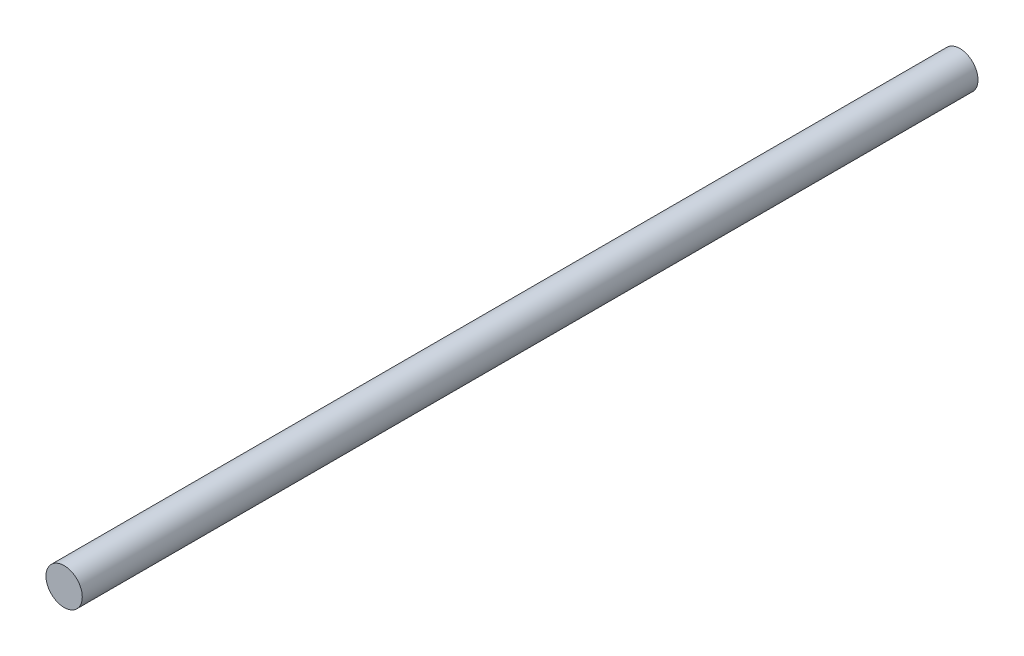
ISO-10303-21;
HEADER;
FILE_DESCRIPTION(('STEP AP214'),'2;1');
FILE_NAME('part.step','',(''),(''),'','','');
FILE_SCHEMA(('AUTOMOTIVE_DESIGN { 1 0 10303 214 1 1 1 1 }'));
ENDSEC;
DATA;
#1=APPLICATION_CONTEXT('core data for automotive mechanical design processes');
#2=APPLICATION_PROTOCOL_DEFINITION('international standard','automotive_design',2000,#1);
#3=PRODUCT_CONTEXT('',#1,'mechanical');
#4=PRODUCT('Part','Part','',(#3));
#5=PRODUCT_RELATED_PRODUCT_CATEGORY('part','',(#4));
#6=PRODUCT_DEFINITION_FORMATION('','',#4);
#7=PRODUCT_DEFINITION_CONTEXT('part definition',#1,'design');
#8=PRODUCT_DEFINITION('design','',#6,#7);
#9=PRODUCT_DEFINITION_SHAPE('','',#8);
#10=(LENGTH_UNIT() NAMED_UNIT(*) SI_UNIT(.MILLI.,.METRE.));
#11=(NAMED_UNIT(*) PLANE_ANGLE_UNIT() SI_UNIT($,.RADIAN.));
#12=(NAMED_UNIT(*) SI_UNIT($,.STERADIAN.) SOLID_ANGLE_UNIT());
#13=UNCERTAINTY_MEASURE_WITH_UNIT(LENGTH_MEASURE(1.E-05),#10,'distance_accuracy_value','');
#14=(GEOMETRIC_REPRESENTATION_CONTEXT(3) GLOBAL_UNCERTAINTY_ASSIGNED_CONTEXT((#13)) GLOBAL_UNIT_ASSIGNED_CONTEXT((#10,
#11,#12)) REPRESENTATION_CONTEXT('',''));
#15=CARTESIAN_POINT('',(0.,0.,0.));
#16=DIRECTION('',(0.,0.,1.));
#17=DIRECTION('',(1.,0.,0.));
#18=AXIS2_PLACEMENT_3D('',#15,#16,#17);
#19=CARTESIAN_POINT('',(0.,0.,74.));
#20=DIRECTION('',(0.,0.,-1.));
#21=DIRECTION('',(-1.,0.,0.));
#22=AXIS2_PLACEMENT_3D('',#19,#20,#21);
#23=CYLINDRICAL_SURFACE('',#22,1.5);
#24=CARTESIAN_POINT('',(0.,0.,74.));
#25=DIRECTION('',(0.,0.,1.));
#26=DIRECTION('',(1.,0.,0.));
#27=AXIS2_PLACEMENT_3D('',#24,#25,#26);
#28=CIRCLE('',#27,1.5);
#29=CARTESIAN_POINT('',(1.5,0.,74.));
#30=VERTEX_POINT('',#29);
#31=EDGE_CURVE('E10',#30,#30,#28,.T.);
#32=ORIENTED_EDGE('',*,*,#31,.F.);
#33=EDGE_LOOP('',(#32));
#34=FACE_BOUND('',#33,.T.);
#35=CARTESIAN_POINT('',(0.,0.,0.));
#36=DIRECTION('',(0.,0.,1.));
#37=DIRECTION('',(1.,0.,0.));
#38=AXIS2_PLACEMENT_3D('',#35,#36,#37);
#39=CIRCLE('',#38,1.5);
#40=CARTESIAN_POINT('',(1.5,0.,0.));
#41=VERTEX_POINT('',#40);
#42=EDGE_CURVE('E34',#41,#41,#39,.T.);
#43=ORIENTED_EDGE('',*,*,#42,.T.);
#44=EDGE_LOOP('',(#43));
#45=FACE_BOUND('',#44,.T.);
#46=ADVANCED_FACE('F28',(#34,#45),#23,.T.);
#47=CARTESIAN_POINT('',(0.,0.,74.));
#48=DIRECTION('',(0.,0.,1.));
#49=DIRECTION('',(1.,0.,0.));
#50=AXIS2_PLACEMENT_3D('',#47,#48,#49);
#51=PLANE('',#50);
#52=ORIENTED_EDGE('',*,*,#31,.T.);
#53=EDGE_LOOP('',(#52));
#54=FACE_BOUND('',#53,.T.);
#55=ADVANCED_FACE('F43',(#54),#51,.T.);
#56=CARTESIAN_POINT('',(0.,0.,0.));
#57=DIRECTION('',(0.,0.,1.));
#58=DIRECTION('',(1.,0.,0.));
#59=AXIS2_PLACEMENT_3D('',#56,#57,#58);
#60=PLANE('',#59);
#61=ORIENTED_EDGE('',*,*,#42,.F.);
#62=EDGE_LOOP('',(#61));
#63=FACE_BOUND('',#62,.T.);
#64=ADVANCED_FACE('F41',(#63),#60,.F.);
#65=CLOSED_SHELL('',(#46,#55,#64));
#66=MANIFOLD_SOLID_BREP('B2',#65);
#67=ADVANCED_BREP_SHAPE_REPRESENTATION('',(#18,#66),#14);
#68=SHAPE_DEFINITION_REPRESENTATION(#9,#67);
ENDSEC;
END-ISO-10303-21;
